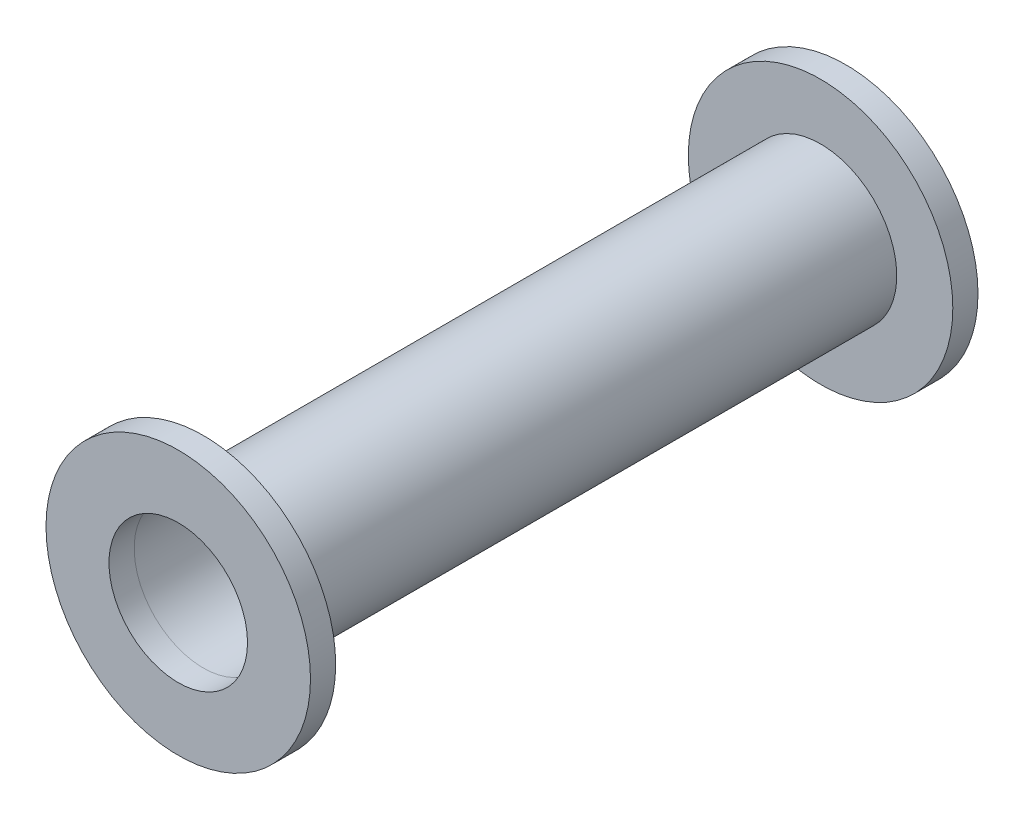
ISO-10303-21;
HEADER;
FILE_DESCRIPTION(('STEP AP214'),'2;1');
FILE_NAME('part.step','',(''),(''),'','','');
FILE_SCHEMA(('AUTOMOTIVE_DESIGN { 1 0 10303 214 1 1 1 1 }'));
ENDSEC;
DATA;
#1=APPLICATION_CONTEXT('core data for automotive mechanical design processes');
#2=APPLICATION_PROTOCOL_DEFINITION('international standard','automotive_design',2000,#1);
#3=PRODUCT_CONTEXT('',#1,'mechanical');
#4=PRODUCT('Part','Part','',(#3));
#5=PRODUCT_RELATED_PRODUCT_CATEGORY('part','',(#4));
#6=PRODUCT_DEFINITION_FORMATION('','',#4);
#7=PRODUCT_DEFINITION_CONTEXT('part definition',#1,'design');
#8=PRODUCT_DEFINITION('design','',#6,#7);
#9=PRODUCT_DEFINITION_SHAPE('','',#8);
#10=(LENGTH_UNIT() NAMED_UNIT(*) SI_UNIT(.MILLI.,.METRE.));
#11=(NAMED_UNIT(*) PLANE_ANGLE_UNIT() SI_UNIT($,.RADIAN.));
#12=(NAMED_UNIT(*) SI_UNIT($,.STERADIAN.) SOLID_ANGLE_UNIT());
#13=UNCERTAINTY_MEASURE_WITH_UNIT(LENGTH_MEASURE(1.E-05),#10,'distance_accuracy_value','');
#14=(GEOMETRIC_REPRESENTATION_CONTEXT(3) GLOBAL_UNCERTAINTY_ASSIGNED_CONTEXT((#13)) GLOBAL_UNIT_ASSIGNED_CONTEXT((#10,
#11,#12)) REPRESENTATION_CONTEXT('',''));
#15=CARTESIAN_POINT('',(0.,0.,0.));
#16=DIRECTION('',(0.,0.,1.));
#17=DIRECTION('',(1.,0.,0.));
#18=AXIS2_PLACEMENT_3D('',#15,#16,#17);
#19=CARTESIAN_POINT('',(0.,0.,49.));
#20=DIRECTION('',(0.,0.,-1.));
#21=DIRECTION('',(-1.,0.,0.));
#22=AXIS2_PLACEMENT_3D('',#19,#20,#21);
#23=CYLINDRICAL_SURFACE('',#22,6.05);
#24=CARTESIAN_POINT('',(0.,0.,49.));
#25=DIRECTION('',(0.,0.,1.));
#26=DIRECTION('',(1.,0.,0.));
#27=AXIS2_PLACEMENT_3D('',#24,#25,#26);
#28=CIRCLE('',#27,6.05);
#29=CARTESIAN_POINT('',(6.05,0.,49.));
#30=VERTEX_POINT('',#29);
#31=EDGE_CURVE('E10',#30,#30,#28,.T.);
#32=ORIENTED_EDGE('',*,*,#31,.F.);
#33=EDGE_LOOP('',(#32));
#34=FACE_BOUND('',#33,.T.);
#35=CARTESIAN_POINT('',(0.,0.,0.));
#36=DIRECTION('',(0.,0.,-1.));
#37=DIRECTION('',(-1.,0.,0.));
#38=AXIS2_PLACEMENT_3D('',#35,#36,#37);
#39=CIRCLE('',#38,6.05);
#40=CARTESIAN_POINT('',(-6.05,0.,0.));
#41=VERTEX_POINT('',#40);
#42=EDGE_CURVE('E70',#41,#41,#39,.T.);
#43=ORIENTED_EDGE('',*,*,#42,.F.);
#44=EDGE_LOOP('',(#43));
#45=FACE_BOUND('',#44,.T.);
#46=ADVANCED_FACE('F41',(#34,#45),#23,.T.);
#47=CARTESIAN_POINT('',(0.,0.,49.));
#48=DIRECTION('',(0.,0.,-1.));
#49=DIRECTION('',(-1.,0.,0.));
#50=AXIS2_PLACEMENT_3D('',#47,#48,#49);
#51=CYLINDRICAL_SURFACE('',#50,5.55);
#52=CARTESIAN_POINT('',(0.,0.,49.));
#53=DIRECTION('',(0.,0.,1.));
#54=DIRECTION('',(1.,0.,0.));
#55=AXIS2_PLACEMENT_3D('',#52,#53,#54);
#56=CIRCLE('',#55,5.55);
#57=CARTESIAN_POINT('',(5.55,0.,49.));
#58=VERTEX_POINT('',#57);
#59=EDGE_CURVE('E51',#58,#58,#56,.T.);
#60=ORIENTED_EDGE('',*,*,#59,.T.);
#61=EDGE_LOOP('',(#60));
#62=FACE_BOUND('',#61,.T.);
#63=CARTESIAN_POINT('',(0.,0.,0.));
#64=DIRECTION('',(0.,0.,1.));
#65=DIRECTION('',(1.,0.,0.));
#66=AXIS2_PLACEMENT_3D('',#63,#64,#65);
#67=CIRCLE('',#66,5.55);
#68=CARTESIAN_POINT('',(5.55,0.,0.));
#69=VERTEX_POINT('',#68);
#70=EDGE_CURVE('E50',#69,#69,#67,.T.);
#71=ORIENTED_EDGE('',*,*,#70,.F.);
#72=EDGE_LOOP('',(#71));
#73=FACE_BOUND('',#72,.T.);
#74=ADVANCED_FACE('F102',(#62,#73),#51,.F.);
#75=CARTESIAN_POINT('',(0.,0.,49.));
#76=DIRECTION('',(0.,0.,1.));
#77=DIRECTION('',(1.,0.,0.));
#78=AXIS2_PLACEMENT_3D('',#75,#76,#77);
#79=PLANE('',#78);
#80=CARTESIAN_POINT('',(0.,0.,49.));
#81=DIRECTION('',(0.,0.,1.));
#82=DIRECTION('',(1.,0.,0.));
#83=AXIS2_PLACEMENT_3D('',#80,#81,#82);
#84=CIRCLE('',#83,10.5);
#85=CARTESIAN_POINT('',(10.5,0.,49.));
#86=VERTEX_POINT('',#85);
#87=EDGE_CURVE('E59',#86,#86,#84,.T.);
#88=ORIENTED_EDGE('',*,*,#87,.F.);
#89=EDGE_LOOP('',(#88));
#90=FACE_BOUND('',#89,.T.);
#91=ORIENTED_EDGE('',*,*,#31,.T.);
#92=EDGE_LOOP('',(#91));
#93=FACE_BOUND('',#92,.T.);
#94=ADVANCED_FACE('F108',(#90,#93),#79,.F.);
#95=CARTESIAN_POINT('',(0.,0.,51.));
#96=DIRECTION('',(0.,0.,1.));
#97=DIRECTION('',(1.,0.,0.));
#98=AXIS2_PLACEMENT_3D('',#95,#96,#97);
#99=PLANE('',#98);
#100=CARTESIAN_POINT('',(0.,0.,51.));
#101=DIRECTION('',(0.,0.,1.));
#102=DIRECTION('',(1.,0.,0.));
#103=AXIS2_PLACEMENT_3D('',#100,#101,#102);
#104=CIRCLE('',#103,10.5);
#105=CARTESIAN_POINT('',(10.5,0.,51.));
#106=VERTEX_POINT('',#105);
#107=EDGE_CURVE('E54',#106,#106,#104,.T.);
#108=ORIENTED_EDGE('',*,*,#107,.T.);
#109=EDGE_LOOP('',(#108));
#110=FACE_BOUND('',#109,.T.);
#111=CARTESIAN_POINT('',(0.,0.,51.));
#112=DIRECTION('',(0.,0.,1.));
#113=DIRECTION('',(1.,0.,0.));
#114=AXIS2_PLACEMENT_3D('',#111,#112,#113);
#115=CIRCLE('',#114,5.5);
#116=CARTESIAN_POINT('',(5.5,0.,51.));
#117=VERTEX_POINT('',#116);
#118=EDGE_CURVE('E61',#117,#117,#115,.T.);
#119=ORIENTED_EDGE('',*,*,#118,.F.);
#120=EDGE_LOOP('',(#119));
#121=FACE_BOUND('',#120,.T.);
#122=ADVANCED_FACE('F117',(#110,#121),#99,.T.);
#123=ORIENTED_EDGE('',*,*,#59,.F.);
#124=EDGE_LOOP('',(#123));
#125=FACE_BOUND('',#124,.T.);
#126=CARTESIAN_POINT('',(0.,0.,49.));
#127=DIRECTION('',(0.,0.,1.));
#128=DIRECTION('',(1.,0.,0.));
#129=AXIS2_PLACEMENT_3D('',#126,#127,#128);
#130=CIRCLE('',#129,5.5);
#131=CARTESIAN_POINT('',(5.5,0.,49.));
#132=VERTEX_POINT('',#131);
#133=EDGE_CURVE('E63',#132,#132,#130,.T.);
#134=ORIENTED_EDGE('',*,*,#133,.T.);
#135=EDGE_LOOP('',(#134));
#136=FACE_BOUND('',#135,.T.);
#137=ADVANCED_FACE('F120',(#125,#136),#79,.F.);
#138=CARTESIAN_POINT('',(0.,0.,51.));
#139=DIRECTION('',(0.,0.,-1.));
#140=DIRECTION('',(-1.,0.,0.));
#141=AXIS2_PLACEMENT_3D('',#138,#139,#140);
#142=CYLINDRICAL_SURFACE('',#141,10.5);
#143=ORIENTED_EDGE('',*,*,#107,.F.);
#144=EDGE_LOOP('',(#143));
#145=FACE_BOUND('',#144,.T.);
#146=ORIENTED_EDGE('',*,*,#87,.T.);
#147=EDGE_LOOP('',(#146));
#148=FACE_BOUND('',#147,.T.);
#149=ADVANCED_FACE('F122',(#145,#148),#142,.T.);
#150=CARTESIAN_POINT('',(0.,0.,51.));
#151=DIRECTION('',(0.,0.,-1.));
#152=DIRECTION('',(-1.,0.,0.));
#153=AXIS2_PLACEMENT_3D('',#150,#151,#152);
#154=CYLINDRICAL_SURFACE('',#153,5.5);
#155=ORIENTED_EDGE('',*,*,#118,.T.);
#156=EDGE_LOOP('',(#155));
#157=FACE_BOUND('',#156,.T.);
#158=ORIENTED_EDGE('',*,*,#133,.F.);
#159=EDGE_LOOP('',(#158));
#160=FACE_BOUND('',#159,.T.);
#161=ADVANCED_FACE('F99',(#157,#160),#154,.F.);
#162=CARTESIAN_POINT('',(0.,0.,0.));
#163=DIRECTION('',(0.,0.,-1.));
#164=DIRECTION('',(-1.,0.,0.));
#165=AXIS2_PLACEMENT_3D('',#162,#163,#164);
#166=PLANE('',#165);
#167=CARTESIAN_POINT('',(0.,0.,0.));
#168=DIRECTION('',(0.,0.,-1.));
#169=DIRECTION('',(-1.,0.,0.));
#170=AXIS2_PLACEMENT_3D('',#167,#168,#169);
#171=CIRCLE('',#170,10.5);
#172=CARTESIAN_POINT('',(-10.5,0.,0.));
#173=VERTEX_POINT('',#172);
#174=EDGE_CURVE('E71',#173,#173,#171,.T.);
#175=ORIENTED_EDGE('',*,*,#174,.F.);
#176=EDGE_LOOP('',(#175));
#177=FACE_BOUND('',#176,.T.);
#178=ORIENTED_EDGE('',*,*,#42,.T.);
#179=EDGE_LOOP('',(#178));
#180=FACE_BOUND('',#179,.T.);
#181=ADVANCED_FACE('F93',(#177,#180),#166,.F.);
#182=CARTESIAN_POINT('',(0.,0.,-2.));
#183=DIRECTION('',(0.,0.,-1.));
#184=DIRECTION('',(-1.,0.,0.));
#185=AXIS2_PLACEMENT_3D('',#182,#183,#184);
#186=PLANE('',#185);
#187=CARTESIAN_POINT('',(0.,0.,-2.));
#188=DIRECTION('',(0.,0.,-1.));
#189=DIRECTION('',(-1.,0.,0.));
#190=AXIS2_PLACEMENT_3D('',#187,#188,#189);
#191=CIRCLE('',#190,10.5);
#192=CARTESIAN_POINT('',(-10.5,0.,-2.));
#193=VERTEX_POINT('',#192);
#194=EDGE_CURVE('E75',#193,#193,#191,.T.);
#195=ORIENTED_EDGE('',*,*,#194,.T.);
#196=EDGE_LOOP('',(#195));
#197=FACE_BOUND('',#196,.T.);
#198=CARTESIAN_POINT('',(0.,0.,-2.));
#199=DIRECTION('',(0.,0.,-1.));
#200=DIRECTION('',(-1.,0.,0.));
#201=AXIS2_PLACEMENT_3D('',#198,#199,#200);
#202=CIRCLE('',#201,5.5);
#203=CARTESIAN_POINT('',(-5.5,0.,-2.));
#204=VERTEX_POINT('',#203);
#205=EDGE_CURVE('E76',#204,#204,#202,.T.);
#206=ORIENTED_EDGE('',*,*,#205,.F.);
#207=EDGE_LOOP('',(#206));
#208=FACE_BOUND('',#207,.T.);
#209=ADVANCED_FACE('F86',(#197,#208),#186,.T.);
#210=ORIENTED_EDGE('',*,*,#70,.T.);
#211=EDGE_LOOP('',(#210));
#212=FACE_BOUND('',#211,.T.);
#213=CARTESIAN_POINT('',(0.,0.,0.));
#214=DIRECTION('',(0.,0.,-1.));
#215=DIRECTION('',(-1.,0.,0.));
#216=AXIS2_PLACEMENT_3D('',#213,#214,#215);
#217=CIRCLE('',#216,5.5);
#218=CARTESIAN_POINT('',(-5.5,0.,0.));
#219=VERTEX_POINT('',#218);
#220=EDGE_CURVE('E78',#219,#219,#217,.T.);
#221=ORIENTED_EDGE('',*,*,#220,.T.);
#222=EDGE_LOOP('',(#221));
#223=FACE_BOUND('',#222,.T.);
#224=ADVANCED_FACE('F89',(#212,#223),#166,.F.);
#225=CARTESIAN_POINT('',(0.,0.,-2.));
#226=DIRECTION('',(0.,0.,1.));
#227=DIRECTION('',(1.,0.,0.));
#228=AXIS2_PLACEMENT_3D('',#225,#226,#227);
#229=CYLINDRICAL_SURFACE('',#228,10.5);
#230=ORIENTED_EDGE('',*,*,#194,.F.);
#231=EDGE_LOOP('',(#230));
#232=FACE_BOUND('',#231,.T.);
#233=ORIENTED_EDGE('',*,*,#174,.T.);
#234=EDGE_LOOP('',(#233));
#235=FACE_BOUND('',#234,.T.);
#236=ADVANCED_FACE('F98',(#232,#235),#229,.T.);
#237=CARTESIAN_POINT('',(0.,0.,-2.));
#238=DIRECTION('',(0.,0.,1.));
#239=DIRECTION('',(1.,0.,0.));
#240=AXIS2_PLACEMENT_3D('',#237,#238,#239);
#241=CYLINDRICAL_SURFACE('',#240,5.5);
#242=ORIENTED_EDGE('',*,*,#205,.T.);
#243=EDGE_LOOP('',(#242));
#244=FACE_BOUND('',#243,.T.);
#245=ORIENTED_EDGE('',*,*,#220,.F.);
#246=EDGE_LOOP('',(#245));
#247=FACE_BOUND('',#246,.T.);
#248=ADVANCED_FACE('F84',(#244,#247),#241,.F.);
#249=CLOSED_SHELL('',(#46,#74,#94,#122,#137,#149,#161,#181,#209,#224,#236,#248));
#250=MANIFOLD_SOLID_BREP('B2',#249);
#251=ADVANCED_BREP_SHAPE_REPRESENTATION('',(#18,#250),#14);
#252=SHAPE_DEFINITION_REPRESENTATION(#9,#251);
ENDSEC;
END-ISO-10303-21;
